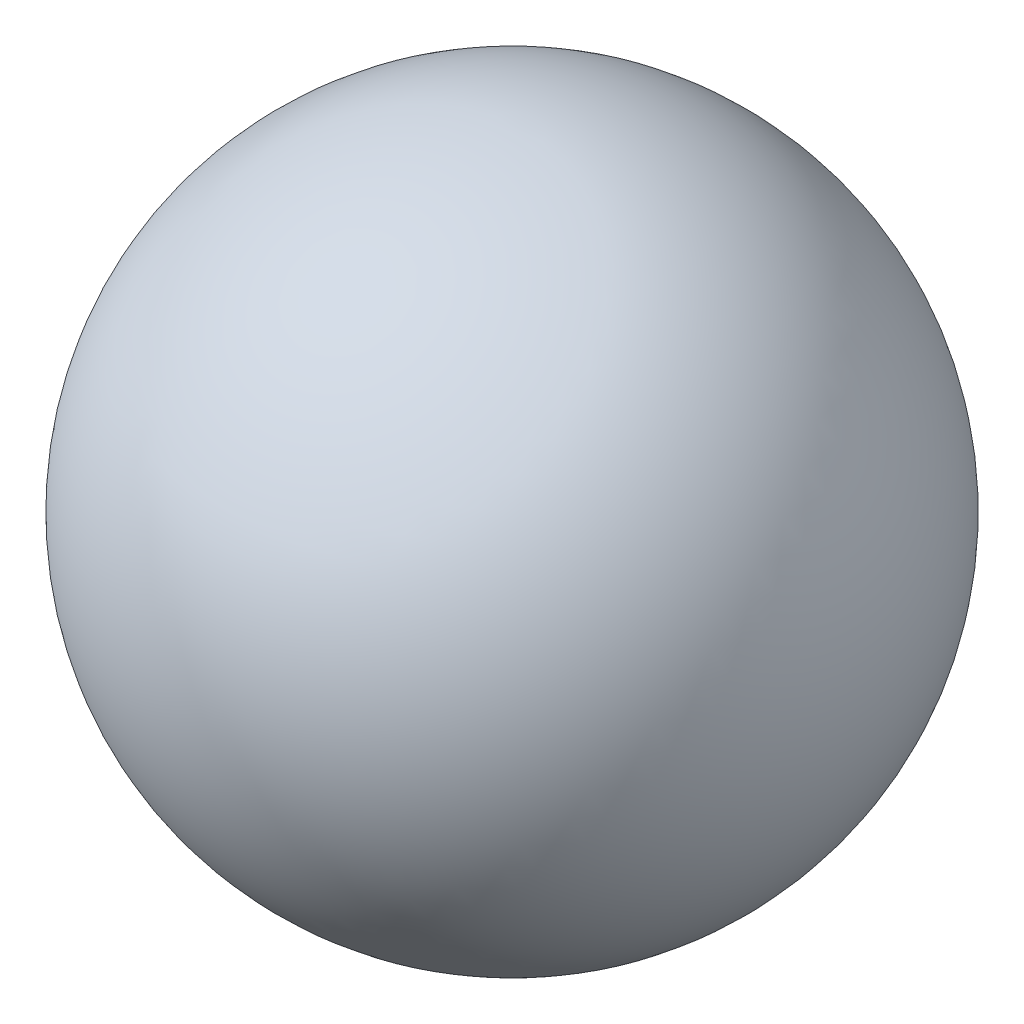
ISO-10303-21;
HEADER;
FILE_DESCRIPTION(('STEP AP214'),'2;1');
FILE_NAME('part.step','',(''),(''),'','','');
FILE_SCHEMA(('AUTOMOTIVE_DESIGN { 1 0 10303 214 1 1 1 1 }'));
ENDSEC;
DATA;
#1=APPLICATION_CONTEXT('core data for automotive mechanical design processes');
#2=APPLICATION_PROTOCOL_DEFINITION('international standard','automotive_design',2000,#1);
#3=PRODUCT_CONTEXT('',#1,'mechanical');
#4=PRODUCT('Part','Part','',(#3));
#5=PRODUCT_RELATED_PRODUCT_CATEGORY('part','',(#4));
#6=PRODUCT_DEFINITION_FORMATION('','',#4);
#7=PRODUCT_DEFINITION_CONTEXT('part definition',#1,'design');
#8=PRODUCT_DEFINITION('design','',#6,#7);
#9=PRODUCT_DEFINITION_SHAPE('','',#8);
#10=(LENGTH_UNIT() NAMED_UNIT(*) SI_UNIT(.MILLI.,.METRE.));
#11=(NAMED_UNIT(*) PLANE_ANGLE_UNIT() SI_UNIT($,.RADIAN.));
#12=(NAMED_UNIT(*) SI_UNIT($,.STERADIAN.) SOLID_ANGLE_UNIT());
#13=UNCERTAINTY_MEASURE_WITH_UNIT(LENGTH_MEASURE(1.E-05),#10,'distance_accuracy_value','');
#14=(GEOMETRIC_REPRESENTATION_CONTEXT(3) GLOBAL_UNCERTAINTY_ASSIGNED_CONTEXT((#13)) GLOBAL_UNIT_ASSIGNED_CONTEXT((#10,
#11,#12)) REPRESENTATION_CONTEXT('',''));
#15=CARTESIAN_POINT('',(0.,0.,0.));
#16=DIRECTION('',(0.,0.,1.));
#17=DIRECTION('',(1.,0.,0.));
#18=AXIS2_PLACEMENT_3D('',#15,#16,#17);
#19=CARTESIAN_POINT('',(0.,0.,0.));
#20=DIRECTION('',(0.,1.,0.));
#21=DIRECTION('',(1.,0.,0.));
#22=AXIS2_PLACEMENT_3D('',#19,#20,#21);
#23=SPHERICAL_SURFACE('',#22,19.6873301353844);
#24=CARTESIAN_POINT('',(0.,19.6873301353844,0.));
#25=VERTEX_POINT('',#24);
#26=VERTEX_LOOP('',#25);
#27=FACE_BOUND('',#26,.T.);
#28=ADVANCED_FACE('F29',(#27),#23,.T.);
#29=CLOSED_SHELL('',(#28));
#30=MANIFOLD_SOLID_BREP('B2',#29);
#31=ADVANCED_BREP_SHAPE_REPRESENTATION('',(#18,#30),#14);
#32=SHAPE_DEFINITION_REPRESENTATION(#9,#31);
ENDSEC;
END-ISO-10303-21;
